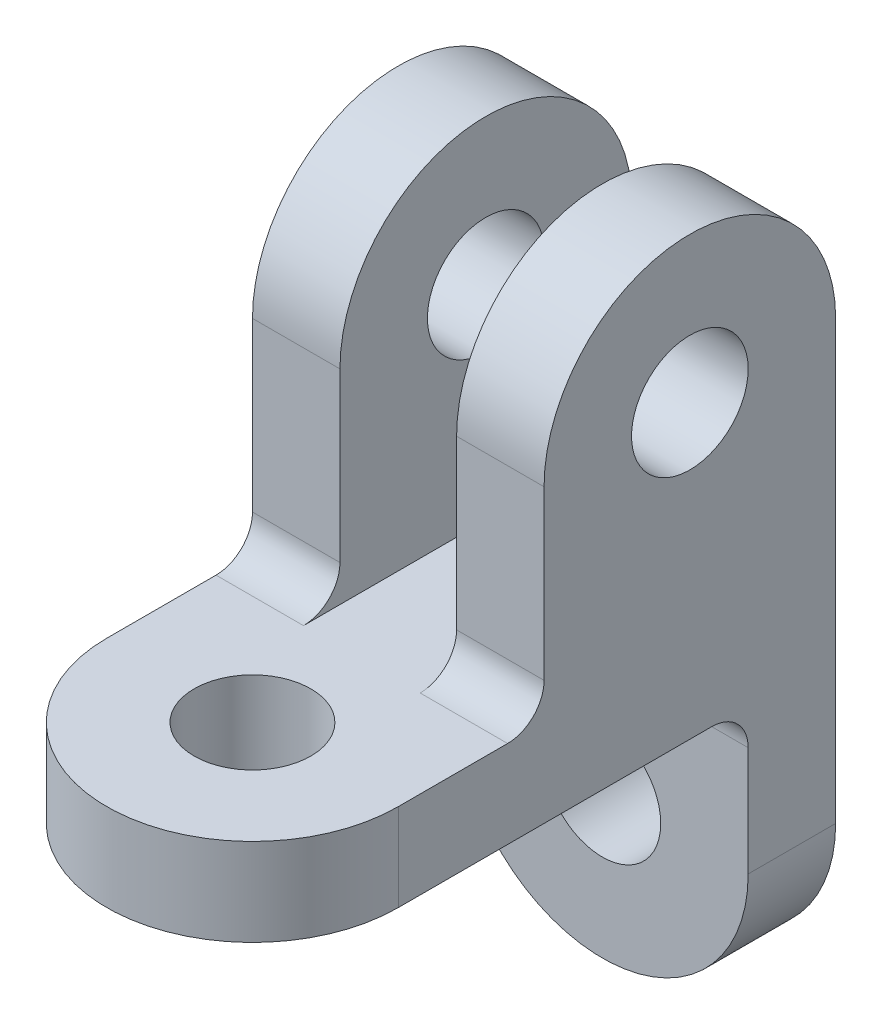
ISO-10303-21;
HEADER;
FILE_DESCRIPTION(('STEP AP214'),'2;1');
FILE_NAME('part.step','',(''),(''),'','','');
FILE_SCHEMA(('AUTOMOTIVE_DESIGN { 1 0 10303 214 1 1 1 1 }'));
ENDSEC;
DATA;
#1=APPLICATION_CONTEXT('core data for automotive mechanical design processes');
#2=APPLICATION_PROTOCOL_DEFINITION('international standard','automotive_design',2000,#1);
#3=PRODUCT_CONTEXT('',#1,'mechanical');
#4=PRODUCT('Part','Part','',(#3));
#5=PRODUCT_RELATED_PRODUCT_CATEGORY('part','',(#4));
#6=PRODUCT_DEFINITION_FORMATION('','',#4);
#7=PRODUCT_DEFINITION_CONTEXT('part definition',#1,'design');
#8=PRODUCT_DEFINITION('design','',#6,#7);
#9=PRODUCT_DEFINITION_SHAPE('','',#8);
#10=(LENGTH_UNIT() NAMED_UNIT(*) SI_UNIT(.MILLI.,.METRE.));
#11=(NAMED_UNIT(*) PLANE_ANGLE_UNIT() SI_UNIT($,.RADIAN.));
#12=(NAMED_UNIT(*) SI_UNIT($,.STERADIAN.) SOLID_ANGLE_UNIT());
#13=UNCERTAINTY_MEASURE_WITH_UNIT(LENGTH_MEASURE(1.E-05),#10,'distance_accuracy_value','');
#14=(GEOMETRIC_REPRESENTATION_CONTEXT(3) GLOBAL_UNCERTAINTY_ASSIGNED_CONTEXT((#13)) GLOBAL_UNIT_ASSIGNED_CONTEXT((#10,
#11,#12)) REPRESENTATION_CONTEXT('',''));
#15=CARTESIAN_POINT('',(0.,0.,0.));
#16=DIRECTION('',(0.,0.,1.));
#17=DIRECTION('',(1.,0.,0.));
#18=AXIS2_PLACEMENT_3D('',#15,#16,#17);
#19=CARTESIAN_POINT('',(40.,0.,12.));
#20=DIRECTION('',(-1.,0.,0.));
#21=DIRECTION('',(0.,0.,1.));
#22=AXIS2_PLACEMENT_3D('',#19,#20,#21);
#23=PLANE('',#22);
#24=CARTESIAN_POINT('',(40.,60.,20.));
#25=DIRECTION('',(1.,0.,0.));
#26=DIRECTION('',(0.,0.,-1.));
#27=AXIS2_PLACEMENT_3D('',#24,#25,#26);
#28=CIRCLE('',#27,8.);
#29=CARTESIAN_POINT('',(40.,60.,12.));
#30=VERTEX_POINT('',#29);
#31=EDGE_CURVE('E555',#30,#30,#28,.T.);
#32=ORIENTED_EDGE('',*,*,#31,.F.);
#33=EDGE_LOOP('',(#32));
#34=FACE_BOUND('',#33,.T.);
#35=DIRECTION('',(0.,1.,0.));
#36=VECTOR('',#35,1.);
#37=CARTESIAN_POINT('',(40.,0.,0.));
#38=LINE('',#37,#36);
#39=CARTESIAN_POINT('',(40.,0.,0.));
#40=VERTEX_POINT('',#39);
#41=CARTESIAN_POINT('',(40.,60.,0.));
#42=VERTEX_POINT('',#41);
#43=EDGE_CURVE('E191',#40,#42,#38,.T.);
#44=ORIENTED_EDGE('',*,*,#43,.T.);
#45=CARTESIAN_POINT('',(40.,60.,20.));
#46=DIRECTION('',(1.,0.,0.));
#47=DIRECTION('',(0.,0.,-1.));
#48=AXIS2_PLACEMENT_3D('',#45,#46,#47);
#49=CIRCLE('',#48,20.);
#50=CARTESIAN_POINT('',(40.,60.,40.));
#51=VERTEX_POINT('',#50);
#52=EDGE_CURVE('E173',#42,#51,#49,.T.);
#53=ORIENTED_EDGE('',*,*,#52,.T.);
#54=DIRECTION('',(0.,-1.,0.));
#55=VECTOR('',#54,1.);
#56=CARTESIAN_POINT('',(40.,80.,40.));
#57=LINE('',#56,#55);
#58=CARTESIAN_POINT('',(40.,37.,40.));
#59=VERTEX_POINT('',#58);
#60=EDGE_CURVE('E323',#51,#59,#57,.T.);
#61=ORIENTED_EDGE('',*,*,#60,.T.);
#62=CARTESIAN_POINT('',(40.,37.,45.));
#63=DIRECTION('',(-1.,0.,0.));
#64=DIRECTION('',(0.,0.,1.));
#65=AXIS2_PLACEMENT_3D('',#62,#63,#64);
#66=CIRCLE('',#65,5.);
#67=CARTESIAN_POINT('',(40.,32.,45.));
#68=VERTEX_POINT('',#67);
#69=EDGE_CURVE('E228',#59,#68,#66,.T.);
#70=ORIENTED_EDGE('',*,*,#69,.T.);
#71=DIRECTION('',(0.,0.,-1.));
#72=VECTOR('',#71,1.);
#73=CARTESIAN_POINT('',(40.,32.,0.));
#74=LINE('',#73,#72);
#75=CARTESIAN_POINT('',(40.,32.,60.));
#76=VERTEX_POINT('',#75);
#77=EDGE_CURVE('E260',#76,#68,#74,.T.);
#78=ORIENTED_EDGE('',*,*,#77,.F.);
#79=DIRECTION('',(0.,-1.,0.));
#80=VECTOR('',#79,1.);
#81=CARTESIAN_POINT('',(40.,32.,60.));
#82=LINE('',#81,#80);
#83=CARTESIAN_POINT('',(40.,20.,60.));
#84=VERTEX_POINT('',#83);
#85=EDGE_CURVE('E271',#76,#84,#82,.T.);
#86=ORIENTED_EDGE('',*,*,#85,.T.);
#87=DIRECTION('',(0.,0.,-1.));
#88=VECTOR('',#87,1.);
#89=CARTESIAN_POINT('',(40.,20.,0.));
#90=LINE('',#89,#88);
#91=CARTESIAN_POINT('',(40.,20.,17.));
#92=VERTEX_POINT('',#91);
#93=EDGE_CURVE('E258',#84,#92,#90,.T.);
#94=ORIENTED_EDGE('',*,*,#93,.T.);
#95=CARTESIAN_POINT('',(40.,15.,17.));
#96=DIRECTION('',(-1.,0.,0.));
#97=DIRECTION('',(0.,0.,1.));
#98=AXIS2_PLACEMENT_3D('',#95,#96,#97);
#99=CIRCLE('',#98,5.);
#100=CARTESIAN_POINT('',(40.,15.,12.));
#101=VERTEX_POINT('',#100);
#102=EDGE_CURVE('E12',#92,#101,#99,.T.);
#103=ORIENTED_EDGE('',*,*,#102,.T.);
#104=DIRECTION('',(0.,1.,0.));
#105=VECTOR('',#104,1.);
#106=CARTESIAN_POINT('',(40.,0.,12.));
#107=LINE('',#106,#105);
#108=CARTESIAN_POINT('',(40.,0.,12.));
#109=VERTEX_POINT('',#108);
#110=EDGE_CURVE('E194',#109,#101,#107,.T.);
#111=ORIENTED_EDGE('',*,*,#110,.F.);
#112=DIRECTION('',(0.,0.,-1.));
#113=VECTOR('',#112,1.);
#114=CARTESIAN_POINT('',(40.,0.,12.));
#115=LINE('',#114,#113);
#116=EDGE_CURVE('E202',#109,#40,#115,.T.);
#117=ORIENTED_EDGE('',*,*,#116,.T.);
#118=EDGE_LOOP('',(#44,#53,#61,#70,#78,#86,#94,#103,#111,#117));
#119=FACE_BOUND('',#118,.T.);
#120=ADVANCED_FACE('F57',(#34,#119),#23,.F.);
#121=CARTESIAN_POINT('',(0.,0.,12.));
#122=DIRECTION('',(1.,0.,0.));
#123=DIRECTION('',(0.,0.,-1.));
#124=AXIS2_PLACEMENT_3D('',#121,#122,#123);
#125=PLANE('',#124);
#126=CARTESIAN_POINT('',(0.,60.,20.));
#127=DIRECTION('',(1.,0.,0.));
#128=DIRECTION('',(0.,0.,-1.));
#129=AXIS2_PLACEMENT_3D('',#126,#127,#128);
#130=CIRCLE('',#129,8.);
#131=CARTESIAN_POINT('',(0.,60.,12.));
#132=VERTEX_POINT('',#131);
#133=EDGE_CURVE('E183',#132,#132,#130,.T.);
#134=ORIENTED_EDGE('',*,*,#133,.T.);
#135=EDGE_LOOP('',(#134));
#136=FACE_BOUND('',#135,.T.);
#137=CARTESIAN_POINT('',(0.,60.,20.));
#138=DIRECTION('',(1.,0.,0.));
#139=DIRECTION('',(0.,0.,-1.));
#140=AXIS2_PLACEMENT_3D('',#137,#138,#139);
#141=CIRCLE('',#140,20.);
#142=CARTESIAN_POINT('',(0.,60.,0.));
#143=VERTEX_POINT('',#142);
#144=CARTESIAN_POINT('',(0.,60.,40.));
#145=VERTEX_POINT('',#144);
#146=EDGE_CURVE('E161',#143,#145,#141,.T.);
#147=ORIENTED_EDGE('',*,*,#146,.F.);
#148=DIRECTION('',(0.,-1.,0.));
#149=VECTOR('',#148,1.);
#150=CARTESIAN_POINT('',(0.,0.,0.));
#151=LINE('',#150,#149);
#152=CARTESIAN_POINT('',(0.,0.,0.));
#153=VERTEX_POINT('',#152);
#154=EDGE_CURVE('E166',#143,#153,#151,.T.);
#155=ORIENTED_EDGE('',*,*,#154,.T.);
#156=DIRECTION('',(0.,0.,-1.));
#157=VECTOR('',#156,1.);
#158=CARTESIAN_POINT('',(0.,0.,12.));
#159=LINE('',#158,#157);
#160=CARTESIAN_POINT('',(0.,0.,12.));
#161=VERTEX_POINT('',#160);
#162=EDGE_CURVE('E200',#161,#153,#159,.T.);
#163=ORIENTED_EDGE('',*,*,#162,.F.);
#164=DIRECTION('',(0.,-1.,0.));
#165=VECTOR('',#164,1.);
#166=CARTESIAN_POINT('',(0.,0.,12.));
#167=LINE('',#166,#165);
#168=CARTESIAN_POINT('',(0.,15.,12.));
#169=VERTEX_POINT('',#168);
#170=EDGE_CURVE('E203',#169,#161,#167,.T.);
#171=ORIENTED_EDGE('',*,*,#170,.F.);
#172=CARTESIAN_POINT('',(0.,15.,17.));
#173=DIRECTION('',(1.,0.,0.));
#174=DIRECTION('',(0.,0.,-1.));
#175=AXIS2_PLACEMENT_3D('',#172,#173,#174);
#176=CIRCLE('',#175,5.);
#177=CARTESIAN_POINT('',(0.,20.,17.));
#178=VERTEX_POINT('',#177);
#179=EDGE_CURVE('E65',#169,#178,#176,.T.);
#180=ORIENTED_EDGE('',*,*,#179,.T.);
#181=DIRECTION('',(0.,0.,1.));
#182=VECTOR('',#181,1.);
#183=CARTESIAN_POINT('',(0.,20.,0.));
#184=LINE('',#183,#182);
#185=CARTESIAN_POINT('',(0.,20.,60.));
#186=VERTEX_POINT('',#185);
#187=EDGE_CURVE('E272',#178,#186,#184,.T.);
#188=ORIENTED_EDGE('',*,*,#187,.T.);
#189=DIRECTION('',(0.,-1.,0.));
#190=VECTOR('',#189,1.);
#191=CARTESIAN_POINT('',(0.,32.,60.));
#192=LINE('',#191,#190);
#193=CARTESIAN_POINT('',(0.,32.,60.));
#194=VERTEX_POINT('',#193);
#195=EDGE_CURVE('E256',#194,#186,#192,.T.);
#196=ORIENTED_EDGE('',*,*,#195,.F.);
#197=DIRECTION('',(0.,0.,1.));
#198=VECTOR('',#197,1.);
#199=CARTESIAN_POINT('',(0.,32.,0.));
#200=LINE('',#199,#198);
#201=CARTESIAN_POINT('',(0.,32.,45.));
#202=VERTEX_POINT('',#201);
#203=EDGE_CURVE('E251',#202,#194,#200,.T.);
#204=ORIENTED_EDGE('',*,*,#203,.F.);
#205=CARTESIAN_POINT('',(0.,37.,45.));
#206=DIRECTION('',(1.,0.,0.));
#207=DIRECTION('',(0.,0.,-1.));
#208=AXIS2_PLACEMENT_3D('',#205,#206,#207);
#209=CIRCLE('',#208,5.);
#210=CARTESIAN_POINT('',(0.,37.,40.));
#211=VERTEX_POINT('',#210);
#212=EDGE_CURVE('E230',#202,#211,#209,.T.);
#213=ORIENTED_EDGE('',*,*,#212,.T.);
#214=DIRECTION('',(0.,1.,0.));
#215=VECTOR('',#214,1.);
#216=CARTESIAN_POINT('',(0.,80.,40.));
#217=LINE('',#216,#215);
#218=EDGE_CURVE('E169',#211,#145,#217,.T.);
#219=ORIENTED_EDGE('',*,*,#218,.T.);
#220=EDGE_LOOP('',(#147,#155,#163,#171,#180,#188,#196,#204,#213,#219));
#221=FACE_BOUND('',#220,.T.);
#222=ADVANCED_FACE('F163',(#136,#221),#125,.F.);
#223=CARTESIAN_POINT('',(28.,80.,40.));
#224=DIRECTION('',(-1.,0.,0.));
#225=DIRECTION('',(0.,0.,1.));
#226=AXIS2_PLACEMENT_3D('',#223,#224,#225);
#227=PLANE('',#226);
#228=CARTESIAN_POINT('',(28.,60.,20.));
#229=DIRECTION('',(-1.,0.,0.));
#230=DIRECTION('',(0.,0.,1.));
#231=AXIS2_PLACEMENT_3D('',#228,#229,#230);
#232=CIRCLE('',#231,8.);
#233=CARTESIAN_POINT('',(28.,60.,28.));
#234=VERTEX_POINT('',#233);
#235=EDGE_CURVE('E212',#234,#234,#232,.T.);
#236=ORIENTED_EDGE('',*,*,#235,.F.);
#237=EDGE_LOOP('',(#236));
#238=FACE_BOUND('',#237,.T.);
#239=CARTESIAN_POINT('',(28.,60.,20.));
#240=DIRECTION('',(-1.,0.,0.));
#241=DIRECTION('',(0.,0.,1.));
#242=AXIS2_PLACEMENT_3D('',#239,#240,#241);
#243=CIRCLE('',#242,20.);
#244=CARTESIAN_POINT('',(28.,60.,40.));
#245=VERTEX_POINT('',#244);
#246=CARTESIAN_POINT('',(28.,60.,0.));
#247=VERTEX_POINT('',#246);
#248=EDGE_CURVE('E541',#245,#247,#243,.T.);
#249=ORIENTED_EDGE('',*,*,#248,.T.);
#250=DIRECTION('',(0.,1.,0.));
#251=VECTOR('',#250,1.);
#252=CARTESIAN_POINT('',(28.,80.,0.));
#253=LINE('',#252,#251);
#254=CARTESIAN_POINT('',(28.,32.,0.));
#255=VERTEX_POINT('',#254);
#256=EDGE_CURVE('E326',#255,#247,#253,.T.);
#257=ORIENTED_EDGE('',*,*,#256,.F.);
#258=DIRECTION('',(0.,0.,-1.));
#259=VECTOR('',#258,1.);
#260=CARTESIAN_POINT('',(28.,32.,40.));
#261=LINE('',#260,#259);
#262=CARTESIAN_POINT('',(28.,32.,45.));
#263=VERTEX_POINT('',#262);
#264=EDGE_CURVE('E317',#263,#255,#261,.T.);
#265=ORIENTED_EDGE('',*,*,#264,.F.);
#266=CARTESIAN_POINT('',(28.,37.,45.));
#267=DIRECTION('',(-1.,0.,0.));
#268=DIRECTION('',(0.,0.,1.));
#269=AXIS2_PLACEMENT_3D('',#266,#267,#268);
#270=CIRCLE('',#269,5.);
#271=CARTESIAN_POINT('',(28.,37.,40.));
#272=VERTEX_POINT('',#271);
#273=EDGE_CURVE('E226',#263,#272,#270,.F.);
#274=ORIENTED_EDGE('',*,*,#273,.T.);
#275=DIRECTION('',(0.,1.,0.));
#276=VECTOR('',#275,1.);
#277=CARTESIAN_POINT('',(28.,80.,40.));
#278=LINE('',#277,#276);
#279=EDGE_CURVE('E315',#272,#245,#278,.T.);
#280=ORIENTED_EDGE('',*,*,#279,.T.);
#281=EDGE_LOOP('',(#249,#257,#265,#274,#280));
#282=FACE_BOUND('',#281,.T.);
#283=ADVANCED_FACE('F314',(#238,#282),#227,.T.);
#284=CARTESIAN_POINT('',(12.,80.,40.));
#285=DIRECTION('',(1.,0.,0.));
#286=DIRECTION('',(0.,0.,-1.));
#287=AXIS2_PLACEMENT_3D('',#284,#285,#286);
#288=PLANE('',#287);
#289=CARTESIAN_POINT('',(12.,60.,20.));
#290=DIRECTION('',(1.,0.,0.));
#291=DIRECTION('',(0.,0.,-1.));
#292=AXIS2_PLACEMENT_3D('',#289,#290,#291);
#293=CIRCLE('',#292,8.);
#294=CARTESIAN_POINT('',(12.,60.,12.));
#295=VERTEX_POINT('',#294);
#296=EDGE_CURVE('E182',#295,#295,#293,.T.);
#297=ORIENTED_EDGE('',*,*,#296,.F.);
#298=EDGE_LOOP('',(#297));
#299=FACE_BOUND('',#298,.T.);
#300=DIRECTION('',(0.,-1.,0.));
#301=VECTOR('',#300,1.);
#302=CARTESIAN_POINT('',(12.,80.,0.));
#303=LINE('',#302,#301);
#304=CARTESIAN_POINT('',(12.,60.,0.));
#305=VERTEX_POINT('',#304);
#306=CARTESIAN_POINT('',(12.,32.,0.));
#307=VERTEX_POINT('',#306);
#308=EDGE_CURVE('E550',#305,#307,#303,.T.);
#309=ORIENTED_EDGE('',*,*,#308,.F.);
#310=CARTESIAN_POINT('',(12.,60.,20.));
#311=DIRECTION('',(1.,0.,0.));
#312=DIRECTION('',(0.,0.,-1.));
#313=AXIS2_PLACEMENT_3D('',#310,#311,#312);
#314=CIRCLE('',#313,20.);
#315=CARTESIAN_POINT('',(12.,60.,40.));
#316=VERTEX_POINT('',#315);
#317=EDGE_CURVE('E179',#305,#316,#314,.T.);
#318=ORIENTED_EDGE('',*,*,#317,.T.);
#319=DIRECTION('',(0.,-1.,0.));
#320=VECTOR('',#319,1.);
#321=CARTESIAN_POINT('',(12.,80.,40.));
#322=LINE('',#321,#320);
#323=CARTESIAN_POINT('',(12.,37.,40.));
#324=VERTEX_POINT('',#323);
#325=EDGE_CURVE('E242',#316,#324,#322,.T.);
#326=ORIENTED_EDGE('',*,*,#325,.T.);
#327=CARTESIAN_POINT('',(12.,37.,45.));
#328=DIRECTION('',(1.,0.,0.));
#329=DIRECTION('',(0.,0.,-1.));
#330=AXIS2_PLACEMENT_3D('',#327,#328,#329);
#331=CIRCLE('',#330,5.);
#332=CARTESIAN_POINT('',(12.,32.,45.));
#333=VERTEX_POINT('',#332);
#334=EDGE_CURVE('E232',#324,#333,#331,.F.);
#335=ORIENTED_EDGE('',*,*,#334,.T.);
#336=DIRECTION('',(0.,0.,-1.));
#337=VECTOR('',#336,1.);
#338=CARTESIAN_POINT('',(12.,32.,40.));
#339=LINE('',#338,#337);
#340=EDGE_CURVE('E240',#333,#307,#339,.T.);
#341=ORIENTED_EDGE('',*,*,#340,.T.);
#342=EDGE_LOOP('',(#309,#318,#326,#335,#341));
#343=FACE_BOUND('',#342,.T.);
#344=ADVANCED_FACE('F239',(#299,#343),#288,.T.);
#345=CARTESIAN_POINT('',(0.,0.,40.));
#346=DIRECTION('',(0.,0.,-1.));
#347=DIRECTION('',(-1.,0.,0.));
#348=AXIS2_PLACEMENT_3D('',#345,#346,#347);
#349=PLANE('',#348);
#350=ORIENTED_EDGE('',*,*,#279,.F.);
#351=DIRECTION('',(-1.,0.,0.));
#352=VECTOR('',#351,1.);
#353=CARTESIAN_POINT('',(0.,37.,40.));
#354=LINE('',#353,#352);
#355=EDGE_CURVE('E218',#272,#59,#354,.F.);
#356=ORIENTED_EDGE('',*,*,#355,.T.);
#357=ORIENTED_EDGE('',*,*,#60,.F.);
#358=DIRECTION('',(1.,0.,0.));
#359=VECTOR('',#358,1.);
#360=CARTESIAN_POINT('',(0.,60.,40.));
#361=LINE('',#360,#359);
#362=EDGE_CURVE('E172',#245,#51,#361,.T.);
#363=ORIENTED_EDGE('',*,*,#362,.F.);
#364=EDGE_LOOP('',(#350,#356,#357,#363));
#365=FACE_BOUND('',#364,.T.);
#366=ADVANCED_FACE('F320',(#365),#349,.F.);
#367=CARTESIAN_POINT('',(20.,32.,60.));
#368=DIRECTION('',(0.,1.,0.));
#369=DIRECTION('',(0.,0.,1.));
#370=AXIS2_PLACEMENT_3D('',#367,#368,#369);
#371=PLANE('',#370);
#372=ORIENTED_EDGE('',*,*,#77,.T.);
#373=DIRECTION('',(-1.,0.,0.));
#374=VECTOR('',#373,1.);
#375=CARTESIAN_POINT('',(20.,32.,45.));
#376=LINE('',#375,#374);
#377=EDGE_CURVE('E215',#68,#263,#376,.T.);
#378=ORIENTED_EDGE('',*,*,#377,.T.);
#379=ORIENTED_EDGE('',*,*,#264,.T.);
#380=DIRECTION('',(-1.,0.,0.));
#381=VECTOR('',#380,1.);
#382=CARTESIAN_POINT('',(0.,32.,0.));
#383=LINE('',#382,#381);
#384=EDGE_CURVE('E269',#255,#307,#383,.T.);
#385=ORIENTED_EDGE('',*,*,#384,.T.);
#386=ORIENTED_EDGE('',*,*,#340,.F.);
#387=DIRECTION('',(-1.,0.,0.));
#388=VECTOR('',#387,1.);
#389=CARTESIAN_POINT('',(0.,32.,45.));
#390=LINE('',#389,#388);
#391=EDGE_CURVE('E209',#333,#202,#390,.T.);
#392=ORIENTED_EDGE('',*,*,#391,.T.);
#393=ORIENTED_EDGE('',*,*,#203,.T.);
#394=CARTESIAN_POINT('',(20.,32.,60.));
#395=DIRECTION('',(0.,1.,0.));
#396=DIRECTION('',(0.,0.,1.));
#397=AXIS2_PLACEMENT_3D('',#394,#395,#396);
#398=CIRCLE('',#397,20.);
#399=EDGE_CURVE('E257',#194,#76,#398,.T.);
#400=ORIENTED_EDGE('',*,*,#399,.T.);
#401=EDGE_LOOP('',(#372,#378,#379,#385,#386,#392,#393,#400));
#402=FACE_BOUND('',#401,.T.);
#403=CARTESIAN_POINT('',(20.,32.,60.));
#404=DIRECTION('',(0.,1.,0.));
#405=DIRECTION('',(0.,0.,1.));
#406=AXIS2_PLACEMENT_3D('',#403,#404,#405);
#407=CIRCLE('',#406,8.);
#408=CARTESIAN_POINT('',(20.,32.,68.));
#409=VERTEX_POINT('',#408);
#410=EDGE_CURVE('E274',#409,#409,#407,.T.);
#411=ORIENTED_EDGE('',*,*,#410,.F.);
#412=EDGE_LOOP('',(#411));
#413=FACE_BOUND('',#412,.T.);
#414=ADVANCED_FACE('F249',(#402,#413),#371,.T.);
#415=CARTESIAN_POINT('',(20.,0.,12.));
#416=DIRECTION('',(0.,0.,1.));
#417=DIRECTION('',(1.,0.,0.));
#418=AXIS2_PLACEMENT_3D('',#415,#416,#417);
#419=PLANE('',#418);
#420=ORIENTED_EDGE('',*,*,#110,.T.);
#421=DIRECTION('',(-1.,0.,0.));
#422=VECTOR('',#421,1.);
#423=CARTESIAN_POINT('',(20.,15.,12.));
#424=LINE('',#423,#422);
#425=EDGE_CURVE('E222',#101,#169,#424,.T.);
#426=ORIENTED_EDGE('',*,*,#425,.T.);
#427=ORIENTED_EDGE('',*,*,#170,.T.);
#428=CARTESIAN_POINT('',(20.,0.,12.));
#429=DIRECTION('',(0.,0.,1.));
#430=DIRECTION('',(1.,0.,0.));
#431=AXIS2_PLACEMENT_3D('',#428,#429,#430);
#432=CIRCLE('',#431,20.);
#433=EDGE_CURVE('E190',#161,#109,#432,.T.);
#434=ORIENTED_EDGE('',*,*,#433,.T.);
#435=EDGE_LOOP('',(#420,#426,#427,#434));
#436=FACE_BOUND('',#435,.T.);
#437=CARTESIAN_POINT('',(20.,0.,12.));
#438=DIRECTION('',(0.,0.,1.));
#439=DIRECTION('',(1.,0.,0.));
#440=AXIS2_PLACEMENT_3D('',#437,#438,#439);
#441=CIRCLE('',#440,8.);
#442=CARTESIAN_POINT('',(28.,0.,12.));
#443=VERTEX_POINT('',#442);
#444=EDGE_CURVE('E280',#443,#443,#441,.T.);
#445=ORIENTED_EDGE('',*,*,#444,.F.);
#446=EDGE_LOOP('',(#445));
#447=FACE_BOUND('',#446,.T.);
#448=ADVANCED_FACE('F292',(#436,#447),#419,.T.);
#449=CARTESIAN_POINT('',(20.,0.,0.));
#450=DIRECTION('',(0.,0.,1.));
#451=DIRECTION('',(1.,0.,0.));
#452=AXIS2_PLACEMENT_3D('',#449,#450,#451);
#453=PLANE('',#452);
#454=ORIENTED_EDGE('',*,*,#154,.F.);
#455=DIRECTION('',(1.,0.,0.));
#456=VECTOR('',#455,1.);
#457=CARTESIAN_POINT('',(0.,60.,0.));
#458=LINE('',#457,#456);
#459=EDGE_CURVE('E176',#143,#305,#458,.T.);
#460=ORIENTED_EDGE('',*,*,#459,.T.);
#461=ORIENTED_EDGE('',*,*,#308,.T.);
#462=ORIENTED_EDGE('',*,*,#384,.F.);
#463=ORIENTED_EDGE('',*,*,#256,.T.);
#464=DIRECTION('',(1.,0.,0.));
#465=VECTOR('',#464,1.);
#466=CARTESIAN_POINT('',(0.,60.,0.));
#467=LINE('',#466,#465);
#468=EDGE_CURVE('E206',#247,#42,#467,.T.);
#469=ORIENTED_EDGE('',*,*,#468,.T.);
#470=ORIENTED_EDGE('',*,*,#43,.F.);
#471=CARTESIAN_POINT('',(20.,0.,0.));
#472=DIRECTION('',(0.,0.,1.));
#473=DIRECTION('',(1.,0.,0.));
#474=AXIS2_PLACEMENT_3D('',#471,#472,#473);
#475=CIRCLE('',#474,20.);
#476=EDGE_CURVE('E189',#153,#40,#475,.T.);
#477=ORIENTED_EDGE('',*,*,#476,.F.);
#478=EDGE_LOOP('',(#454,#460,#461,#462,#463,#469,#470,#477));
#479=FACE_BOUND('',#478,.T.);
#480=CARTESIAN_POINT('',(20.,0.,0.));
#481=DIRECTION('',(0.,0.,1.));
#482=DIRECTION('',(1.,0.,0.));
#483=AXIS2_PLACEMENT_3D('',#480,#481,#482);
#484=CIRCLE('',#483,8.);
#485=CARTESIAN_POINT('',(28.,0.,0.));
#486=VERTEX_POINT('',#485);
#487=EDGE_CURVE('E279',#486,#486,#484,.T.);
#488=ORIENTED_EDGE('',*,*,#487,.T.);
#489=EDGE_LOOP('',(#488));
#490=FACE_BOUND('',#489,.T.);
#491=ADVANCED_FACE('F186',(#479,#490),#453,.F.);
#492=CARTESIAN_POINT('',(20.,0.,12.));
#493=DIRECTION('',(0.,0.,-1.));
#494=DIRECTION('',(-1.,0.,0.));
#495=AXIS2_PLACEMENT_3D('',#492,#493,#494);
#496=CYLINDRICAL_SURFACE('',#495,20.);
#497=ORIENTED_EDGE('',*,*,#476,.T.);
#498=ORIENTED_EDGE('',*,*,#116,.F.);
#499=ORIENTED_EDGE('',*,*,#433,.F.);
#500=ORIENTED_EDGE('',*,*,#162,.T.);
#501=EDGE_LOOP('',(#497,#498,#499,#500));
#502=FACE_BOUND('',#501,.T.);
#503=ADVANCED_FACE('F289',(#502),#496,.T.);
#504=CARTESIAN_POINT('',(20.,0.,12.));
#505=DIRECTION('',(0.,0.,-1.));
#506=DIRECTION('',(-1.,0.,0.));
#507=AXIS2_PLACEMENT_3D('',#504,#505,#506);
#508=CYLINDRICAL_SURFACE('',#507,8.);
#509=ORIENTED_EDGE('',*,*,#444,.T.);
#510=EDGE_LOOP('',(#509));
#511=FACE_BOUND('',#510,.T.);
#512=ORIENTED_EDGE('',*,*,#487,.F.);
#513=EDGE_LOOP('',(#512));
#514=FACE_BOUND('',#513,.T.);
#515=ADVANCED_FACE('F363',(#511,#514),#508,.F.);
#516=CARTESIAN_POINT('',(20.,20.,60.));
#517=DIRECTION('',(0.,1.,0.));
#518=DIRECTION('',(0.,0.,1.));
#519=AXIS2_PLACEMENT_3D('',#516,#517,#518);
#520=PLANE('',#519);
#521=ORIENTED_EDGE('',*,*,#187,.F.);
#522=DIRECTION('',(-1.,0.,0.));
#523=VECTOR('',#522,1.);
#524=CARTESIAN_POINT('',(20.,20.,17.));
#525=LINE('',#524,#523);
#526=EDGE_CURVE('E78',#178,#92,#525,.F.);
#527=ORIENTED_EDGE('',*,*,#526,.T.);
#528=ORIENTED_EDGE('',*,*,#93,.F.);
#529=CARTESIAN_POINT('',(20.,20.,60.));
#530=DIRECTION('',(0.,1.,0.));
#531=DIRECTION('',(0.,0.,1.));
#532=AXIS2_PLACEMENT_3D('',#529,#530,#531);
#533=CIRCLE('',#532,20.);
#534=EDGE_CURVE('E262',#186,#84,#533,.T.);
#535=ORIENTED_EDGE('',*,*,#534,.F.);
#536=EDGE_LOOP('',(#521,#527,#528,#535));
#537=FACE_BOUND('',#536,.T.);
#538=CARTESIAN_POINT('',(20.,20.,60.));
#539=DIRECTION('',(0.,1.,0.));
#540=DIRECTION('',(0.,0.,1.));
#541=AXIS2_PLACEMENT_3D('',#538,#539,#540);
#542=CIRCLE('',#541,8.);
#543=CARTESIAN_POINT('',(20.,20.,68.));
#544=VERTEX_POINT('',#543);
#545=EDGE_CURVE('E265',#544,#544,#542,.T.);
#546=ORIENTED_EDGE('',*,*,#545,.T.);
#547=EDGE_LOOP('',(#546));
#548=FACE_BOUND('',#547,.T.);
#549=ADVANCED_FACE('F301',(#537,#548),#520,.F.);
#550=CARTESIAN_POINT('',(20.,32.,60.));
#551=DIRECTION('',(0.,-1.,0.));
#552=DIRECTION('',(0.,0.,-1.));
#553=AXIS2_PLACEMENT_3D('',#550,#551,#552);
#554=CYLINDRICAL_SURFACE('',#553,20.);
#555=ORIENTED_EDGE('',*,*,#534,.T.);
#556=ORIENTED_EDGE('',*,*,#85,.F.);
#557=ORIENTED_EDGE('',*,*,#399,.F.);
#558=ORIENTED_EDGE('',*,*,#195,.T.);
#559=EDGE_LOOP('',(#555,#556,#557,#558));
#560=FACE_BOUND('',#559,.T.);
#561=ADVANCED_FACE('F304',(#560),#554,.T.);
#562=CARTESIAN_POINT('',(20.,32.,60.));
#563=DIRECTION('',(0.,-1.,0.));
#564=DIRECTION('',(0.,0.,-1.));
#565=AXIS2_PLACEMENT_3D('',#562,#563,#564);
#566=CYLINDRICAL_SURFACE('',#565,8.);
#567=ORIENTED_EDGE('',*,*,#410,.T.);
#568=EDGE_LOOP('',(#567));
#569=FACE_BOUND('',#568,.T.);
#570=ORIENTED_EDGE('',*,*,#545,.F.);
#571=EDGE_LOOP('',(#570));
#572=FACE_BOUND('',#571,.T.);
#573=ADVANCED_FACE('F337',(#569,#572),#566,.F.);
#574=CARTESIAN_POINT('',(0.,0.,40.));
#575=DIRECTION('',(0.,0.,1.));
#576=DIRECTION('',(1.,0.,0.));
#577=AXIS2_PLACEMENT_3D('',#574,#575,#576);
#578=PLANE('',#577);
#579=ORIENTED_EDGE('',*,*,#218,.F.);
#580=DIRECTION('',(-1.,0.,0.));
#581=VECTOR('',#580,1.);
#582=CARTESIAN_POINT('',(12.,37.,40.));
#583=LINE('',#582,#581);
#584=EDGE_CURVE('E220',#211,#324,#583,.F.);
#585=ORIENTED_EDGE('',*,*,#584,.T.);
#586=ORIENTED_EDGE('',*,*,#325,.F.);
#587=EDGE_CURVE('E542',#145,#316,#361,.T.);
#588=ORIENTED_EDGE('',*,*,#587,.F.);
#589=EDGE_LOOP('',(#579,#585,#586,#588));
#590=FACE_BOUND('',#589,.T.);
#591=ADVANCED_FACE('F339',(#590),#578,.T.);
#592=CARTESIAN_POINT('',(0.,60.,20.));
#593=DIRECTION('',(1.,0.,0.));
#594=DIRECTION('',(0.,0.,-1.));
#595=AXIS2_PLACEMENT_3D('',#592,#593,#594);
#596=CYLINDRICAL_SURFACE('',#595,20.);
#597=ORIENTED_EDGE('',*,*,#317,.F.);
#598=ORIENTED_EDGE('',*,*,#459,.F.);
#599=ORIENTED_EDGE('',*,*,#146,.T.);
#600=ORIENTED_EDGE('',*,*,#587,.T.);
#601=EDGE_LOOP('',(#597,#598,#599,#600));
#602=FACE_BOUND('',#601,.T.);
#603=ADVANCED_FACE('F177',(#602),#596,.T.);
#604=ORIENTED_EDGE('',*,*,#362,.T.);
#605=ORIENTED_EDGE('',*,*,#52,.F.);
#606=ORIENTED_EDGE('',*,*,#468,.F.);
#607=ORIENTED_EDGE('',*,*,#248,.F.);
#608=EDGE_LOOP('',(#604,#605,#606,#607));
#609=FACE_BOUND('',#608,.T.);
#610=ADVANCED_FACE('F479',(#609),#596,.T.);
#611=CARTESIAN_POINT('',(0.,60.,20.));
#612=DIRECTION('',(1.,0.,0.));
#613=DIRECTION('',(0.,0.,-1.));
#614=AXIS2_PLACEMENT_3D('',#611,#612,#613);
#615=CYLINDRICAL_SURFACE('',#614,8.);
#616=ORIENTED_EDGE('',*,*,#296,.T.);
#617=EDGE_LOOP('',(#616));
#618=FACE_BOUND('',#617,.T.);
#619=ORIENTED_EDGE('',*,*,#133,.F.);
#620=EDGE_LOOP('',(#619));
#621=FACE_BOUND('',#620,.T.);
#622=ADVANCED_FACE('F469',(#618,#621),#615,.F.);
#623=ORIENTED_EDGE('',*,*,#235,.T.);
#624=EDGE_LOOP('',(#623));
#625=FACE_BOUND('',#624,.T.);
#626=ORIENTED_EDGE('',*,*,#31,.T.);
#627=EDGE_LOOP('',(#626));
#628=FACE_BOUND('',#627,.T.);
#629=ADVANCED_FACE('F365',(#625,#628),#615,.F.);
#630=CARTESIAN_POINT('',(20.,37.,45.));
#631=DIRECTION('',(-1.,0.,0.));
#632=DIRECTION('',(0.,0.,1.));
#633=AXIS2_PLACEMENT_3D('',#630,#631,#632);
#634=CYLINDRICAL_SURFACE('',#633,5.);
#635=ORIENTED_EDGE('',*,*,#69,.F.);
#636=ORIENTED_EDGE('',*,*,#355,.F.);
#637=ORIENTED_EDGE('',*,*,#273,.F.);
#638=ORIENTED_EDGE('',*,*,#377,.F.);
#639=EDGE_LOOP('',(#635,#636,#637,#638));
#640=FACE_BOUND('',#639,.T.);
#641=ADVANCED_FACE('F310',(#640),#634,.F.);
#642=CARTESIAN_POINT('',(20.,37.,45.));
#643=DIRECTION('',(1.,0.,0.));
#644=DIRECTION('',(0.,0.,-1.));
#645=AXIS2_PLACEMENT_3D('',#642,#643,#644);
#646=CYLINDRICAL_SURFACE('',#645,5.);
#647=ORIENTED_EDGE('',*,*,#334,.F.);
#648=ORIENTED_EDGE('',*,*,#584,.F.);
#649=ORIENTED_EDGE('',*,*,#212,.F.);
#650=ORIENTED_EDGE('',*,*,#391,.F.);
#651=EDGE_LOOP('',(#647,#648,#649,#650));
#652=FACE_BOUND('',#651,.T.);
#653=ADVANCED_FACE('F245',(#652),#646,.F.);
#654=CARTESIAN_POINT('',(20.,15.,17.));
#655=DIRECTION('',(-1.,0.,0.));
#656=DIRECTION('',(0.,0.,1.));
#657=AXIS2_PLACEMENT_3D('',#654,#655,#656);
#658=CYLINDRICAL_SURFACE('',#657,5.);
#659=ORIENTED_EDGE('',*,*,#102,.F.);
#660=ORIENTED_EDGE('',*,*,#526,.F.);
#661=ORIENTED_EDGE('',*,*,#179,.F.);
#662=ORIENTED_EDGE('',*,*,#425,.F.);
#663=EDGE_LOOP('',(#659,#660,#661,#662));
#664=FACE_BOUND('',#663,.T.);
#665=ADVANCED_FACE('F59',(#664),#658,.F.);
#666=CLOSED_SHELL('',(#120,#222,#283,#344,#366,#414,#448,#491,#503,#515,#549,#561,#573,#591,
#603,#610,#622,#629,#641,#653,#665));
#667=MANIFOLD_SOLID_BREP('B2',#666);
#668=ADVANCED_BREP_SHAPE_REPRESENTATION('',(#18,#667),#14);
#669=SHAPE_DEFINITION_REPRESENTATION(#9,#668);
ENDSEC;
END-ISO-10303-21;
